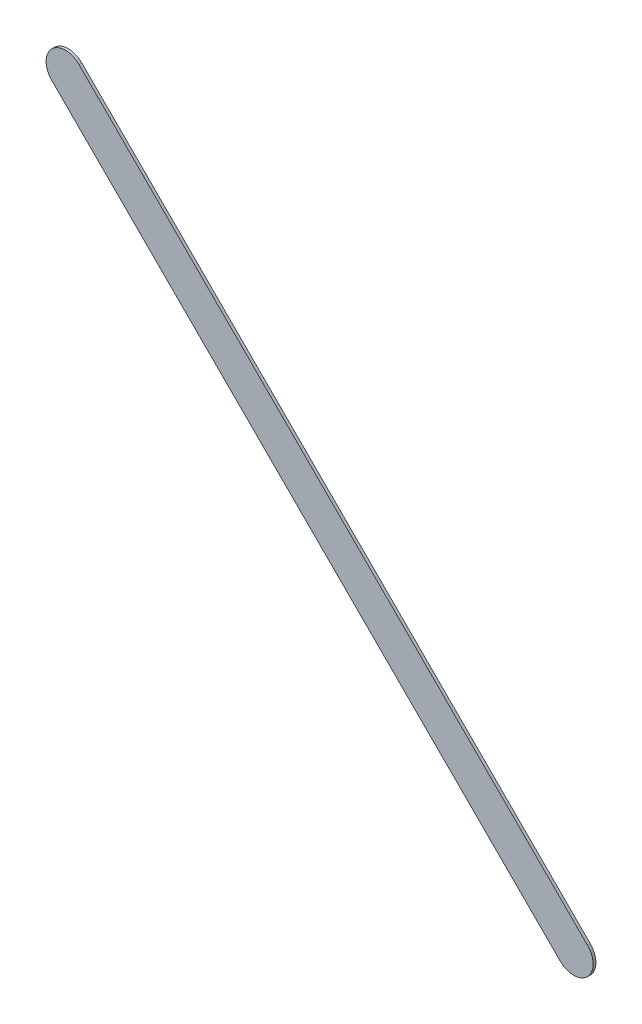
ISO-10303-21;
HEADER;
FILE_DESCRIPTION(('STEP AP214'),'2;1');
FILE_NAME('part.step','',(''),(''),'','','');
FILE_SCHEMA(('AUTOMOTIVE_DESIGN { 1 0 10303 214 1 1 1 1 }'));
ENDSEC;
DATA;
#1=APPLICATION_CONTEXT('core data for automotive mechanical design processes');
#2=APPLICATION_PROTOCOL_DEFINITION('international standard','automotive_design',2000,#1);
#3=PRODUCT_CONTEXT('',#1,'mechanical');
#4=PRODUCT('Part','Part','',(#3));
#5=PRODUCT_RELATED_PRODUCT_CATEGORY('part','',(#4));
#6=PRODUCT_DEFINITION_FORMATION('','',#4);
#7=PRODUCT_DEFINITION_CONTEXT('part definition',#1,'design');
#8=PRODUCT_DEFINITION('design','',#6,#7);
#9=PRODUCT_DEFINITION_SHAPE('','',#8);
#10=(LENGTH_UNIT() NAMED_UNIT(*) SI_UNIT(.MILLI.,.METRE.));
#11=(NAMED_UNIT(*) PLANE_ANGLE_UNIT() SI_UNIT($,.RADIAN.));
#12=(NAMED_UNIT(*) SI_UNIT($,.STERADIAN.) SOLID_ANGLE_UNIT());
#13=UNCERTAINTY_MEASURE_WITH_UNIT(LENGTH_MEASURE(1.E-05),#10,'distance_accuracy_value','');
#14=(GEOMETRIC_REPRESENTATION_CONTEXT(3) GLOBAL_UNCERTAINTY_ASSIGNED_CONTEXT((#13)) GLOBAL_UNIT_ASSIGNED_CONTEXT((#10,
#11,#12)) REPRESENTATION_CONTEXT('',''));
#15=CARTESIAN_POINT('',(0.,0.,0.));
#16=DIRECTION('',(0.,0.,1.));
#17=DIRECTION('',(1.,0.,0.));
#18=AXIS2_PLACEMENT_3D('',#15,#16,#17);
#19=CARTESIAN_POINT('',(68.11957674,69.3980705,0.));
#20=DIRECTION('',(0.707106781186548,0.707106781186547,0.));
#21=DIRECTION('',(0.707106781186547,-0.707106781186548,0.));
#22=AXIS2_PLACEMENT_3D('',#19,#20,#21);
#23=PLANE('',#22);
#24=DIRECTION('',(0.707106781186547,-0.707106781186548,0.));
#25=VECTOR('',#24,1.);
#26=CARTESIAN_POINT('',(68.11957674,69.3980705,0.03556));
#27=LINE('',#26,#25);
#28=CARTESIAN_POINT('',(68.11957674,69.3980705,0.03556));
#29=VERTEX_POINT('',#28);
#30=CARTESIAN_POINT('',(74.69442262,62.82322462,0.03556));
#31=VERTEX_POINT('',#30);
#32=EDGE_CURVE('E11',#29,#31,#27,.T.);
#33=ORIENTED_EDGE('',*,*,#32,.F.);
#34=DIRECTION('',(0.,0.,1.));
#35=VECTOR('',#34,1.);
#36=CARTESIAN_POINT('',(68.11957674,69.3980705,0.));
#37=LINE('',#36,#35);
#38=CARTESIAN_POINT('',(68.11957674,69.3980705,0.));
#39=VERTEX_POINT('',#38);
#40=EDGE_CURVE('E24',#39,#29,#37,.T.);
#41=ORIENTED_EDGE('',*,*,#40,.F.);
#42=DIRECTION('',(0.707106781186547,-0.707106781186548,0.));
#43=VECTOR('',#42,1.);
#44=CARTESIAN_POINT('',(68.11957674,69.3980705,0.));
#45=LINE('',#44,#43);
#46=CARTESIAN_POINT('',(74.69442262,62.82322462,0.));
#47=VERTEX_POINT('',#46);
#48=EDGE_CURVE('E75',#39,#47,#45,.T.);
#49=ORIENTED_EDGE('',*,*,#48,.T.);
#50=DIRECTION('',(0.,0.,1.));
#51=VECTOR('',#50,1.);
#52=CARTESIAN_POINT('',(74.69442262,62.82322462,0.));
#53=LINE('',#52,#51);
#54=EDGE_CURVE('E37',#47,#31,#53,.T.);
#55=ORIENTED_EDGE('',*,*,#54,.T.);
#56=EDGE_LOOP('',(#33,#41,#49,#55));
#57=FACE_BOUND('',#56,.T.);
#58=ADVANCED_FACE('F17',(#57),#23,.F.);
#59=CARTESIAN_POINT('',(74.871199,63.000001,0.));
#60=DIRECTION('',(0.,0.,-1.));
#61=DIRECTION('',(-0.707106781186519,-0.707106781186576,0.));
#62=AXIS2_PLACEMENT_3D('',#59,#60,#61);
#63=CYLINDRICAL_SURFACE('',#62,0.249999554103225);
#64=CARTESIAN_POINT('',(74.871199,63.000001,0.03556));
#65=DIRECTION('',(0.,0.,1.));
#66=DIRECTION('',(-0.707106781186519,-0.707106781186576,0.));
#67=AXIS2_PLACEMENT_3D('',#64,#65,#66);
#68=CIRCLE('',#67,0.249999554103225);
#69=CARTESIAN_POINT('',(75.04797538,63.17677738,0.03556));
#70=VERTEX_POINT('',#69);
#71=EDGE_CURVE('E83',#31,#70,#68,.T.);
#72=ORIENTED_EDGE('',*,*,#71,.F.);
#73=ORIENTED_EDGE('',*,*,#54,.F.);
#74=CARTESIAN_POINT('',(74.871199,63.000001,0.));
#75=DIRECTION('',(0.,0.,1.));
#76=DIRECTION('',(-0.707106781186519,-0.707106781186576,0.));
#77=AXIS2_PLACEMENT_3D('',#74,#75,#76);
#78=CIRCLE('',#77,0.249999554103225);
#79=CARTESIAN_POINT('',(75.04797538,63.17677738,0.));
#80=VERTEX_POINT('',#79);
#81=EDGE_CURVE('E81',#47,#80,#78,.T.);
#82=ORIENTED_EDGE('',*,*,#81,.T.);
#83=DIRECTION('',(0.,0.,1.));
#84=VECTOR('',#83,1.);
#85=CARTESIAN_POINT('',(75.04797538,63.17677738,0.));
#86=LINE('',#85,#84);
#87=EDGE_CURVE('E67',#80,#70,#86,.T.);
#88=ORIENTED_EDGE('',*,*,#87,.T.);
#89=EDGE_LOOP('',(#72,#73,#82,#88));
#90=FACE_BOUND('',#89,.T.);
#91=ADVANCED_FACE('F89',(#90),#63,.T.);
#92=CARTESIAN_POINT('',(75.04797538,63.17677738,0.));
#93=DIRECTION('',(-0.707106781186548,-0.707106781186547,0.));
#94=DIRECTION('',(-0.707106781186547,0.707106781186548,0.));
#95=AXIS2_PLACEMENT_3D('',#92,#93,#94);
#96=PLANE('',#95);
#97=DIRECTION('',(-0.707106781186547,0.707106781186548,0.));
#98=VECTOR('',#97,1.);
#99=CARTESIAN_POINT('',(75.04797538,63.17677738,0.03556));
#100=LINE('',#99,#98);
#101=CARTESIAN_POINT('',(68.4731295,69.75162326,0.03556));
#102=VERTEX_POINT('',#101);
#103=EDGE_CURVE('E71',#70,#102,#100,.T.);
#104=ORIENTED_EDGE('',*,*,#103,.F.);
#105=ORIENTED_EDGE('',*,*,#87,.F.);
#106=DIRECTION('',(-0.707106781186547,0.707106781186548,0.));
#107=VECTOR('',#106,1.);
#108=CARTESIAN_POINT('',(75.04797538,63.17677738,0.));
#109=LINE('',#108,#107);
#110=CARTESIAN_POINT('',(68.4731295,69.75162326,0.));
#111=VERTEX_POINT('',#110);
#112=EDGE_CURVE('E63',#80,#111,#109,.T.);
#113=ORIENTED_EDGE('',*,*,#112,.T.);
#114=DIRECTION('',(0.,0.,1.));
#115=VECTOR('',#114,1.);
#116=CARTESIAN_POINT('',(68.4731295,69.75162326,0.));
#117=LINE('',#116,#115);
#118=EDGE_CURVE('E53',#111,#102,#117,.T.);
#119=ORIENTED_EDGE('',*,*,#118,.T.);
#120=EDGE_LOOP('',(#104,#105,#113,#119));
#121=FACE_BOUND('',#120,.T.);
#122=ADVANCED_FACE('F66',(#121),#96,.F.);
#123=CARTESIAN_POINT('',(68.29635312,69.57484688,0.));
#124=DIRECTION('',(0.,0.,-1.));
#125=DIRECTION('',(0.707106781186548,0.707106781186548,0.));
#126=AXIS2_PLACEMENT_3D('',#123,#124,#125);
#127=CYLINDRICAL_SURFACE('',#126,0.24999955410322);
#128=CARTESIAN_POINT('',(68.29635312,69.57484688,0.03556));
#129=DIRECTION('',(0.,0.,1.));
#130=DIRECTION('',(0.707106781186548,0.707106781186548,0.));
#131=AXIS2_PLACEMENT_3D('',#128,#129,#130);
#132=CIRCLE('',#131,0.24999955410322);
#133=EDGE_CURVE('E59',#102,#29,#132,.T.);
#134=ORIENTED_EDGE('',*,*,#133,.F.);
#135=ORIENTED_EDGE('',*,*,#118,.F.);
#136=CARTESIAN_POINT('',(68.29635312,69.57484688,0.));
#137=DIRECTION('',(0.,0.,1.));
#138=DIRECTION('',(0.707106781186548,0.707106781186548,0.));
#139=AXIS2_PLACEMENT_3D('',#136,#137,#138);
#140=CIRCLE('',#139,0.24999955410322);
#141=EDGE_CURVE('E57',#111,#39,#140,.T.);
#142=ORIENTED_EDGE('',*,*,#141,.T.);
#143=ORIENTED_EDGE('',*,*,#40,.T.);
#144=EDGE_LOOP('',(#134,#135,#142,#143));
#145=FACE_BOUND('',#144,.T.);
#146=ADVANCED_FACE('F55',(#145),#127,.T.);
#147=CARTESIAN_POINT('',(68.11957674,69.3980705,0.));
#148=DIRECTION('',(0.,0.,-1.));
#149=DIRECTION('',(-1.,0.,0.));
#150=AXIS2_PLACEMENT_3D('',#147,#148,#149);
#151=PLANE('',#150);
#152=ORIENTED_EDGE('',*,*,#141,.F.);
#153=ORIENTED_EDGE('',*,*,#112,.F.);
#154=ORIENTED_EDGE('',*,*,#81,.F.);
#155=ORIENTED_EDGE('',*,*,#48,.F.);
#156=EDGE_LOOP('',(#152,#153,#154,#155));
#157=FACE_BOUND('',#156,.T.);
#158=ADVANCED_FACE('F74',(#157),#151,.T.);
#159=CARTESIAN_POINT('',(68.11957674,69.3980705,0.03556));
#160=DIRECTION('',(0.,0.,-1.));
#161=DIRECTION('',(-1.,0.,0.));
#162=AXIS2_PLACEMENT_3D('',#159,#160,#161);
#163=PLANE('',#162);
#164=ORIENTED_EDGE('',*,*,#32,.T.);
#165=ORIENTED_EDGE('',*,*,#71,.T.);
#166=ORIENTED_EDGE('',*,*,#103,.T.);
#167=ORIENTED_EDGE('',*,*,#133,.T.);
#168=EDGE_LOOP('',(#164,#165,#166,#167));
#169=FACE_BOUND('',#168,.T.);
#170=ADVANCED_FACE('F91',(#169),#163,.F.);
#171=CLOSED_SHELL('',(#58,#91,#122,#146,#158,#170));
#172=MANIFOLD_SOLID_BREP('B1',#171);
#173=ADVANCED_BREP_SHAPE_REPRESENTATION('',(#18,#172),#14);
#174=SHAPE_DEFINITION_REPRESENTATION(#9,#173);
ENDSEC;
END-ISO-10303-21;
